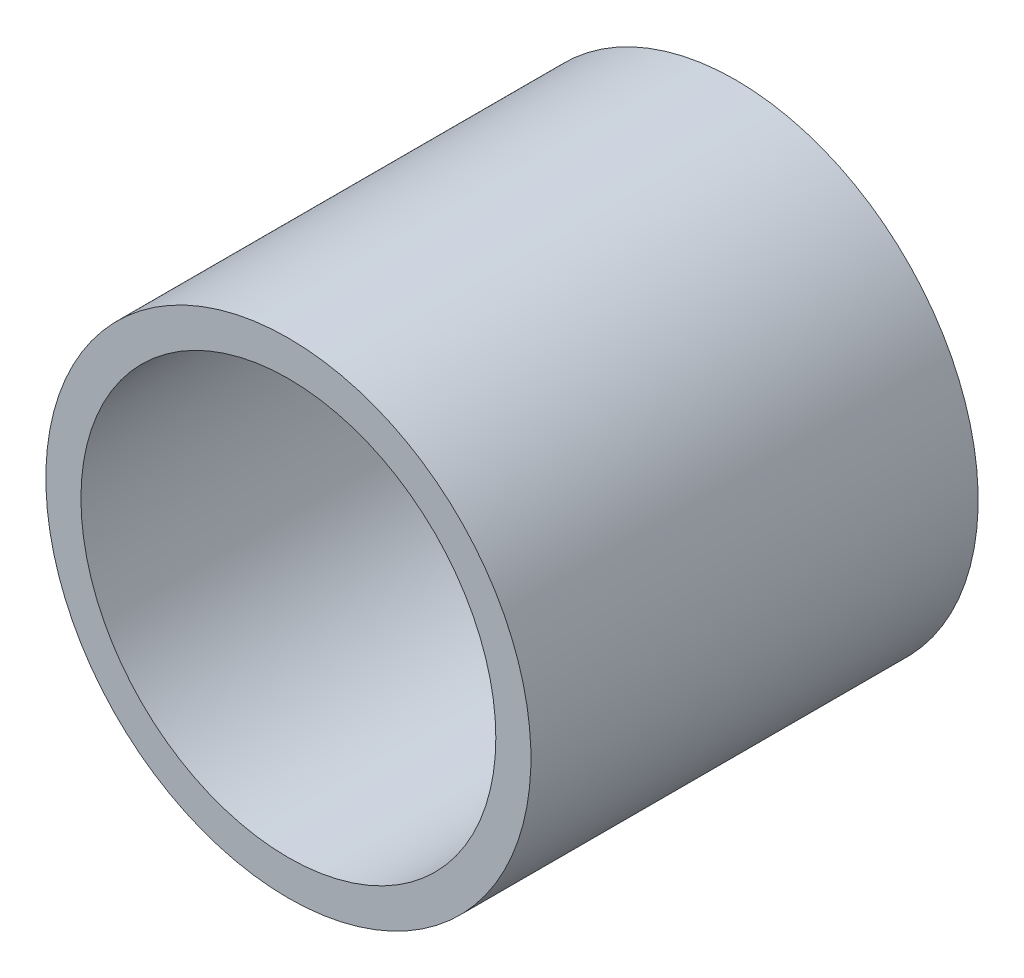
ISO-10303-21;
HEADER;
FILE_DESCRIPTION(('STEP AP214'),'2;1');
FILE_NAME('part.step','',(''),(''),'','','');
FILE_SCHEMA(('AUTOMOTIVE_DESIGN { 1 0 10303 214 1 1 1 1 }'));
ENDSEC;
DATA;
#1=APPLICATION_CONTEXT('core data for automotive mechanical design processes');
#2=APPLICATION_PROTOCOL_DEFINITION('international standard','automotive_design',2000,#1);
#3=PRODUCT_CONTEXT('',#1,'mechanical');
#4=PRODUCT('Part','Part','',(#3));
#5=PRODUCT_RELATED_PRODUCT_CATEGORY('part','',(#4));
#6=PRODUCT_DEFINITION_FORMATION('','',#4);
#7=PRODUCT_DEFINITION_CONTEXT('part definition',#1,'design');
#8=PRODUCT_DEFINITION('design','',#6,#7);
#9=PRODUCT_DEFINITION_SHAPE('','',#8);
#10=(LENGTH_UNIT() NAMED_UNIT(*) SI_UNIT(.MILLI.,.METRE.));
#11=(NAMED_UNIT(*) PLANE_ANGLE_UNIT() SI_UNIT($,.RADIAN.));
#12=(NAMED_UNIT(*) SI_UNIT($,.STERADIAN.) SOLID_ANGLE_UNIT());
#13=UNCERTAINTY_MEASURE_WITH_UNIT(LENGTH_MEASURE(1.E-05),#10,'distance_accuracy_value','');
#14=(GEOMETRIC_REPRESENTATION_CONTEXT(3) GLOBAL_UNCERTAINTY_ASSIGNED_CONTEXT((#13)) GLOBAL_UNIT_ASSIGNED_CONTEXT((#10,
#11,#12)) REPRESENTATION_CONTEXT('',''));
#15=CARTESIAN_POINT('',(0.,0.,0.));
#16=DIRECTION('',(0.,0.,1.));
#17=DIRECTION('',(1.,0.,0.));
#18=AXIS2_PLACEMENT_3D('',#15,#16,#17);
#19=CARTESIAN_POINT('',(0.,0.,6.5));
#20=DIRECTION('',(0.,0.,-1.));
#21=DIRECTION('',(0.,1.,0.));
#22=AXIS2_PLACEMENT_3D('',#19,#20,#21);
#23=CYLINDRICAL_SURFACE('',#22,7.05);
#24=CARTESIAN_POINT('',(0.,0.,6.5));
#25=DIRECTION('',(0.,0.,-1.));
#26=DIRECTION('',(0.,1.,0.));
#27=AXIS2_PLACEMENT_3D('',#24,#25,#26);
#28=CIRCLE('',#27,7.05);
#29=CARTESIAN_POINT('',(0.,7.05,6.5));
#30=VERTEX_POINT('',#29);
#31=EDGE_CURVE('E19',#30,#30,#28,.F.);
#32=ORIENTED_EDGE('',*,*,#31,.F.);
#33=EDGE_LOOP('',(#32));
#34=FACE_BOUND('',#33,.T.);
#35=CARTESIAN_POINT('',(0.,0.,-6.5));
#36=DIRECTION('',(0.,0.,-1.));
#37=DIRECTION('',(0.,1.,0.));
#38=AXIS2_PLACEMENT_3D('',#35,#36,#37);
#39=CIRCLE('',#38,7.05);
#40=CARTESIAN_POINT('',(0.,7.05,-6.5));
#41=VERTEX_POINT('',#40);
#42=EDGE_CURVE('E28',#41,#41,#39,.F.);
#43=ORIENTED_EDGE('',*,*,#42,.T.);
#44=EDGE_LOOP('',(#43));
#45=FACE_BOUND('',#44,.T.);
#46=ADVANCED_FACE('F15',(#34,#45),#23,.T.);
#47=CARTESIAN_POINT('',(-7.1346,-7.1346,6.5));
#48=DIRECTION('',(0.,0.,1.));
#49=DIRECTION('',(1.,0.,0.));
#50=AXIS2_PLACEMENT_3D('',#47,#48,#49);
#51=PLANE('',#50);
#52=CARTESIAN_POINT('',(0.,0.,6.5));
#53=DIRECTION('',(0.,0.,-1.));
#54=DIRECTION('',(0.,1.,0.));
#55=AXIS2_PLACEMENT_3D('',#52,#53,#54);
#56=CIRCLE('',#55,6.03);
#57=CARTESIAN_POINT('',(0.,6.03,6.5));
#58=VERTEX_POINT('',#57);
#59=EDGE_CURVE('E23',#58,#58,#56,.F.);
#60=ORIENTED_EDGE('',*,*,#59,.F.);
#61=EDGE_LOOP('',(#60));
#62=FACE_BOUND('',#61,.T.);
#63=ORIENTED_EDGE('',*,*,#31,.T.);
#64=EDGE_LOOP('',(#63));
#65=FACE_BOUND('',#64,.T.);
#66=ADVANCED_FACE('F36',(#62,#65),#51,.T.);
#67=CARTESIAN_POINT('',(-7.1346,-7.1346,-6.5));
#68=DIRECTION('',(0.,0.,1.));
#69=DIRECTION('',(1.,0.,0.));
#70=AXIS2_PLACEMENT_3D('',#67,#68,#69);
#71=PLANE('',#70);
#72=CARTESIAN_POINT('',(0.,0.,-6.5));
#73=DIRECTION('',(0.,0.,-1.));
#74=DIRECTION('',(0.,1.,0.));
#75=AXIS2_PLACEMENT_3D('',#72,#73,#74);
#76=CIRCLE('',#75,6.03);
#77=CARTESIAN_POINT('',(0.,6.03,-6.5));
#78=VERTEX_POINT('',#77);
#79=EDGE_CURVE('E10',#78,#78,#76,.T.);
#80=ORIENTED_EDGE('',*,*,#79,.F.);
#81=EDGE_LOOP('',(#80));
#82=FACE_BOUND('',#81,.T.);
#83=ORIENTED_EDGE('',*,*,#42,.F.);
#84=EDGE_LOOP('',(#83));
#85=FACE_BOUND('',#84,.T.);
#86=ADVANCED_FACE('F17',(#82,#85),#71,.F.);
#87=CARTESIAN_POINT('',(0.,0.,6.5));
#88=DIRECTION('',(0.,0.,-1.));
#89=DIRECTION('',(0.,1.,0.));
#90=AXIS2_PLACEMENT_3D('',#87,#88,#89);
#91=CYLINDRICAL_SURFACE('',#90,6.03);
#92=ORIENTED_EDGE('',*,*,#79,.T.);
#93=EDGE_LOOP('',(#92));
#94=FACE_BOUND('',#93,.T.);
#95=ORIENTED_EDGE('',*,*,#59,.T.);
#96=EDGE_LOOP('',(#95));
#97=FACE_BOUND('',#96,.T.);
#98=ADVANCED_FACE('F46',(#94,#97),#91,.F.);
#99=CLOSED_SHELL('',(#46,#66,#86,#98));
#100=MANIFOLD_SOLID_BREP('B1',#99);
#101=ADVANCED_BREP_SHAPE_REPRESENTATION('',(#18,#100),#14);
#102=SHAPE_DEFINITION_REPRESENTATION(#9,#101);
ENDSEC;
END-ISO-10303-21;
